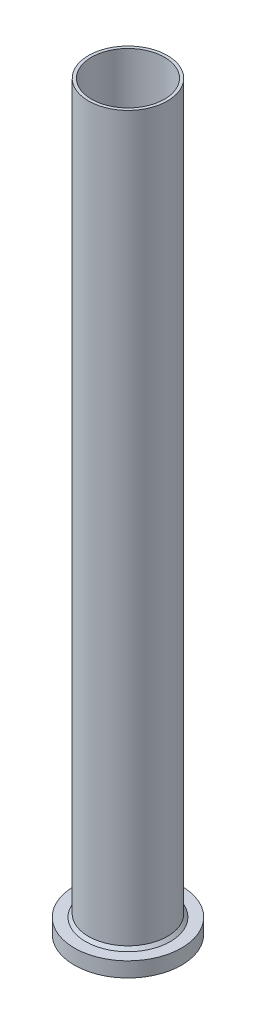
ISO-10303-21;
HEADER;
FILE_DESCRIPTION(('STEP AP214'),'2;1');
FILE_NAME('part.step','',(''),(''),'','','');
FILE_SCHEMA(('AUTOMOTIVE_DESIGN { 1 0 10303 214 1 1 1 1 }'));
ENDSEC;
DATA;
#1=APPLICATION_CONTEXT('core data for automotive mechanical design processes');
#2=APPLICATION_PROTOCOL_DEFINITION('international standard','automotive_design',2000,#1);
#3=PRODUCT_CONTEXT('',#1,'mechanical');
#4=PRODUCT('Part','Part','',(#3));
#5=PRODUCT_RELATED_PRODUCT_CATEGORY('part','',(#4));
#6=PRODUCT_DEFINITION_FORMATION('','',#4);
#7=PRODUCT_DEFINITION_CONTEXT('part definition',#1,'design');
#8=PRODUCT_DEFINITION('design','',#6,#7);
#9=PRODUCT_DEFINITION_SHAPE('','',#8);
#10=(LENGTH_UNIT() NAMED_UNIT(*) SI_UNIT(.MILLI.,.METRE.));
#11=(NAMED_UNIT(*) PLANE_ANGLE_UNIT() SI_UNIT($,.RADIAN.));
#12=(NAMED_UNIT(*) SI_UNIT($,.STERADIAN.) SOLID_ANGLE_UNIT());
#13=UNCERTAINTY_MEASURE_WITH_UNIT(LENGTH_MEASURE(1.E-05),#10,'distance_accuracy_value','');
#14=(GEOMETRIC_REPRESENTATION_CONTEXT(3) GLOBAL_UNCERTAINTY_ASSIGNED_CONTEXT((#13)) GLOBAL_UNIT_ASSIGNED_CONTEXT((#10,
#11,#12)) REPRESENTATION_CONTEXT('',''));
#15=CARTESIAN_POINT('',(0.,0.,0.));
#16=DIRECTION('',(0.,0.,1.));
#17=DIRECTION('',(1.,0.,0.));
#18=AXIS2_PLACEMENT_3D('',#15,#16,#17);
#19=CARTESIAN_POINT('',(0.,5.,0.));
#20=DIRECTION('',(0.,1.,0.));
#21=DIRECTION('',(0.,0.,1.));
#22=AXIS2_PLACEMENT_3D('',#19,#20,#21);
#23=PLANE('',#22);
#24=CARTESIAN_POINT('',(0.,5.,0.));
#25=DIRECTION('',(0.,1.,0.));
#26=DIRECTION('',(0.,0.,1.));
#27=AXIS2_PLACEMENT_3D('',#24,#25,#26);
#28=CIRCLE('',#27,14.25);
#29=CARTESIAN_POINT('',(0.,5.,14.25));
#30=VERTEX_POINT('',#29);
#31=EDGE_CURVE('E48',#30,#30,#28,.F.);
#32=ORIENTED_EDGE('',*,*,#31,.T.);
#33=EDGE_LOOP('',(#32));
#34=FACE_BOUND('',#33,.T.);
#35=CARTESIAN_POINT('',(0.,5.,0.));
#36=DIRECTION('',(0.,1.,0.));
#37=DIRECTION('',(0.,0.,1.));
#38=AXIS2_PLACEMENT_3D('',#35,#36,#37);
#39=CIRCLE('',#38,18.);
#40=CARTESIAN_POINT('',(0.,5.,18.));
#41=VERTEX_POINT('',#40);
#42=EDGE_CURVE('E185',#41,#41,#39,.T.);
#43=ORIENTED_EDGE('',*,*,#42,.T.);
#44=EDGE_LOOP('',(#43));
#45=FACE_BOUND('',#44,.T.);
#46=ADVANCED_FACE('F39',(#34,#45),#23,.T.);
#47=CARTESIAN_POINT('',(0.,0.,0.));
#48=DIRECTION('',(0.,1.,0.));
#49=DIRECTION('',(0.,0.,1.));
#50=AXIS2_PLACEMENT_3D('',#47,#48,#49);
#51=PLANE('',#50);
#52=CARTESIAN_POINT('',(0.,0.,0.));
#53=DIRECTION('',(0.,1.,0.));
#54=DIRECTION('',(0.,0.,1.));
#55=AXIS2_PLACEMENT_3D('',#52,#53,#54);
#56=CIRCLE('',#55,18.);
#57=CARTESIAN_POINT('',(0.,0.,18.));
#58=VERTEX_POINT('',#57);
#59=EDGE_CURVE('E127',#58,#58,#56,.T.);
#60=ORIENTED_EDGE('',*,*,#59,.F.);
#61=EDGE_LOOP('',(#60));
#62=FACE_BOUND('',#61,.T.);
#63=DIRECTION('',(1.,0.,0.));
#64=VECTOR('',#63,1.);
#65=CARTESIAN_POINT('',(-8.08290376865476,0.,14.));
#66=LINE('',#65,#64);
#67=CARTESIAN_POINT('',(-8.08290376865476,0.,14.));
#68=VERTEX_POINT('',#67);
#69=CARTESIAN_POINT('',(8.08290376865477,0.,14.));
#70=VERTEX_POINT('',#69);
#71=EDGE_CURVE('E55',#68,#70,#66,.T.);
#72=ORIENTED_EDGE('',*,*,#71,.T.);
#73=DIRECTION('',(0.5,0.,-0.866025403784439));
#74=VECTOR('',#73,1.);
#75=CARTESIAN_POINT('',(8.08290376865477,0.,14.));
#76=LINE('',#75,#74);
#77=CARTESIAN_POINT('',(16.1658075373095,0.,0.));
#78=VERTEX_POINT('',#77);
#79=EDGE_CURVE('E112',#70,#78,#76,.T.);
#80=ORIENTED_EDGE('',*,*,#79,.T.);
#81=DIRECTION('',(-0.5,0.,-0.866025403784438));
#82=VECTOR('',#81,1.);
#83=CARTESIAN_POINT('',(16.1658075373095,0.,0.));
#84=LINE('',#83,#82);
#85=CARTESIAN_POINT('',(8.08290376865475,0.,-14.));
#86=VERTEX_POINT('',#85);
#87=EDGE_CURVE('E110',#78,#86,#84,.T.);
#88=ORIENTED_EDGE('',*,*,#87,.T.);
#89=DIRECTION('',(-1.,0.,0.));
#90=VECTOR('',#89,1.);
#91=CARTESIAN_POINT('',(8.08290376865475,0.,-14.));
#92=LINE('',#91,#90);
#93=CARTESIAN_POINT('',(-8.08290376865476,0.,-14.));
#94=VERTEX_POINT('',#93);
#95=EDGE_CURVE('E90',#86,#94,#92,.T.);
#96=ORIENTED_EDGE('',*,*,#95,.T.);
#97=DIRECTION('',(-0.5,0.,0.866025403784439));
#98=VECTOR('',#97,1.);
#99=CARTESIAN_POINT('',(-8.08290376865476,0.,-14.));
#100=LINE('',#99,#98);
#101=CARTESIAN_POINT('',(-16.1658075373095,0.,0.));
#102=VERTEX_POINT('',#101);
#103=EDGE_CURVE('E99',#94,#102,#100,.T.);
#104=ORIENTED_EDGE('',*,*,#103,.T.);
#105=DIRECTION('',(0.5,0.,0.866025403784438));
#106=VECTOR('',#105,1.);
#107=CARTESIAN_POINT('',(-16.1658075373095,0.,0.));
#108=LINE('',#107,#106);
#109=EDGE_CURVE('E105',#102,#68,#108,.T.);
#110=ORIENTED_EDGE('',*,*,#109,.T.);
#111=EDGE_LOOP('',(#72,#80,#88,#96,#104,#110));
#112=FACE_BOUND('',#111,.T.);
#113=ADVANCED_FACE('F107',(#62,#112),#51,.F.);
#114=CARTESIAN_POINT('',(0.,4.,0.));
#115=DIRECTION('',(0.,-1.,0.));
#116=DIRECTION('',(0.,0.,-1.));
#117=AXIS2_PLACEMENT_3D('',#114,#115,#116);
#118=CYLINDRICAL_SURFACE('',#117,18.);
#119=ORIENTED_EDGE('',*,*,#59,.T.);
#120=EDGE_LOOP('',(#119));
#121=FACE_BOUND('',#120,.T.);
#122=ORIENTED_EDGE('',*,*,#42,.F.);
#123=EDGE_LOOP('',(#122));
#124=FACE_BOUND('',#123,.T.);
#125=ADVANCED_FACE('F149',(#121,#124),#118,.T.);
#126=CARTESIAN_POINT('',(-8.08290376865476,4.,14.));
#127=DIRECTION('',(0.,0.,-1.));
#128=DIRECTION('',(-1.,0.,0.));
#129=AXIS2_PLACEMENT_3D('',#126,#127,#128);
#130=PLANE('',#129);
#131=ORIENTED_EDGE('',*,*,#71,.F.);
#132=DIRECTION('',(0.,-1.,0.));
#133=VECTOR('',#132,1.);
#134=CARTESIAN_POINT('',(-8.08290376865476,4.,14.));
#135=LINE('',#134,#133);
#136=CARTESIAN_POINT('',(-8.08290376865476,4.,14.));
#137=VERTEX_POINT('',#136);
#138=EDGE_CURVE('E118',#137,#68,#135,.T.);
#139=ORIENTED_EDGE('',*,*,#138,.F.);
#140=DIRECTION('',(1.,0.,0.));
#141=VECTOR('',#140,1.);
#142=CARTESIAN_POINT('',(-8.08290376865476,4.,14.));
#143=LINE('',#142,#141);
#144=CARTESIAN_POINT('',(8.08290376865477,4.,14.));
#145=VERTEX_POINT('',#144);
#146=EDGE_CURVE('E117',#137,#145,#143,.T.);
#147=ORIENTED_EDGE('',*,*,#146,.T.);
#148=DIRECTION('',(0.,-1.,0.));
#149=VECTOR('',#148,1.);
#150=CARTESIAN_POINT('',(8.08290376865477,4.,14.));
#151=LINE('',#150,#149);
#152=EDGE_CURVE('E125',#145,#70,#151,.T.);
#153=ORIENTED_EDGE('',*,*,#152,.T.);
#154=EDGE_LOOP('',(#131,#139,#147,#153));
#155=FACE_BOUND('',#154,.T.);
#156=ADVANCED_FACE('F174',(#155),#130,.T.);
#157=CARTESIAN_POINT('',(8.08290376865477,4.,14.));
#158=DIRECTION('',(-0.866025403784439,0.,-0.5));
#159=DIRECTION('',(-0.5,0.,0.866025403784439));
#160=AXIS2_PLACEMENT_3D('',#157,#158,#159);
#161=PLANE('',#160);
#162=ORIENTED_EDGE('',*,*,#79,.F.);
#163=ORIENTED_EDGE('',*,*,#152,.F.);
#164=DIRECTION('',(0.5,0.,-0.866025403784439));
#165=VECTOR('',#164,1.);
#166=CARTESIAN_POINT('',(8.08290376865477,4.,14.));
#167=LINE('',#166,#165);
#168=CARTESIAN_POINT('',(16.1658075373095,4.,0.));
#169=VERTEX_POINT('',#168);
#170=EDGE_CURVE('E196',#145,#169,#167,.T.);
#171=ORIENTED_EDGE('',*,*,#170,.T.);
#172=DIRECTION('',(0.,-1.,0.));
#173=VECTOR('',#172,1.);
#174=CARTESIAN_POINT('',(16.1658075373095,4.,0.));
#175=LINE('',#174,#173);
#176=EDGE_CURVE('E123',#169,#78,#175,.T.);
#177=ORIENTED_EDGE('',*,*,#176,.T.);
#178=EDGE_LOOP('',(#162,#163,#171,#177));
#179=FACE_BOUND('',#178,.T.);
#180=ADVANCED_FACE('F170',(#179),#161,.T.);
#181=CARTESIAN_POINT('',(16.1658075373095,4.,0.));
#182=DIRECTION('',(-0.866025403784438,0.,0.5));
#183=DIRECTION('',(0.5,0.,0.866025403784438));
#184=AXIS2_PLACEMENT_3D('',#181,#182,#183);
#185=PLANE('',#184);
#186=ORIENTED_EDGE('',*,*,#87,.F.);
#187=ORIENTED_EDGE('',*,*,#176,.F.);
#188=DIRECTION('',(-0.5,0.,-0.866025403784438));
#189=VECTOR('',#188,1.);
#190=CARTESIAN_POINT('',(16.1658075373095,4.,0.));
#191=LINE('',#190,#189);
#192=CARTESIAN_POINT('',(8.08290376865475,4.,-14.));
#193=VERTEX_POINT('',#192);
#194=EDGE_CURVE('E199',#169,#193,#191,.T.);
#195=ORIENTED_EDGE('',*,*,#194,.T.);
#196=DIRECTION('',(0.,-1.,0.));
#197=VECTOR('',#196,1.);
#198=CARTESIAN_POINT('',(8.08290376865475,4.,-14.));
#199=LINE('',#198,#197);
#200=EDGE_CURVE('E95',#193,#86,#199,.T.);
#201=ORIENTED_EDGE('',*,*,#200,.T.);
#202=EDGE_LOOP('',(#186,#187,#195,#201));
#203=FACE_BOUND('',#202,.T.);
#204=ADVANCED_FACE('F167',(#203),#185,.T.);
#205=CARTESIAN_POINT('',(8.08290376865475,4.,-14.));
#206=DIRECTION('',(0.,0.,1.));
#207=DIRECTION('',(1.,0.,0.));
#208=AXIS2_PLACEMENT_3D('',#205,#206,#207);
#209=PLANE('',#208);
#210=ORIENTED_EDGE('',*,*,#95,.F.);
#211=ORIENTED_EDGE('',*,*,#200,.F.);
#212=DIRECTION('',(-1.,0.,0.));
#213=VECTOR('',#212,1.);
#214=CARTESIAN_POINT('',(8.08290376865475,4.,-14.));
#215=LINE('',#214,#213);
#216=CARTESIAN_POINT('',(-8.08290376865476,4.,-14.));
#217=VERTEX_POINT('',#216);
#218=EDGE_CURVE('E64',#193,#217,#215,.T.);
#219=ORIENTED_EDGE('',*,*,#218,.T.);
#220=DIRECTION('',(0.,-1.,0.));
#221=VECTOR('',#220,1.);
#222=CARTESIAN_POINT('',(-8.08290376865476,4.,-14.));
#223=LINE('',#222,#221);
#224=EDGE_CURVE('E85',#217,#94,#223,.T.);
#225=ORIENTED_EDGE('',*,*,#224,.T.);
#226=EDGE_LOOP('',(#210,#211,#219,#225));
#227=FACE_BOUND('',#226,.T.);
#228=ADVANCED_FACE('F87',(#227),#209,.T.);
#229=CARTESIAN_POINT('',(-8.08290376865476,4.,-14.));
#230=DIRECTION('',(0.866025403784439,0.,0.5));
#231=DIRECTION('',(0.5,0.,-0.866025403784439));
#232=AXIS2_PLACEMENT_3D('',#229,#230,#231);
#233=PLANE('',#232);
#234=ORIENTED_EDGE('',*,*,#103,.F.);
#235=ORIENTED_EDGE('',*,*,#224,.F.);
#236=DIRECTION('',(-0.5,0.,0.866025403784439));
#237=VECTOR('',#236,1.);
#238=CARTESIAN_POINT('',(-8.08290376865476,4.,-14.));
#239=LINE('',#238,#237);
#240=CARTESIAN_POINT('',(-16.1658075373095,4.,0.));
#241=VERTEX_POINT('',#240);
#242=EDGE_CURVE('E202',#217,#241,#239,.T.);
#243=ORIENTED_EDGE('',*,*,#242,.T.);
#244=DIRECTION('',(0.,-1.,0.));
#245=VECTOR('',#244,1.);
#246=CARTESIAN_POINT('',(-16.1658075373095,4.,0.));
#247=LINE('',#246,#245);
#248=EDGE_CURVE('E96',#241,#102,#247,.T.);
#249=ORIENTED_EDGE('',*,*,#248,.T.);
#250=EDGE_LOOP('',(#234,#235,#243,#249));
#251=FACE_BOUND('',#250,.T.);
#252=ADVANCED_FACE('F100',(#251),#233,.T.);
#253=CARTESIAN_POINT('',(-16.1658075373095,4.,0.));
#254=DIRECTION('',(0.866025403784438,0.,-0.5));
#255=DIRECTION('',(-0.5,0.,-0.866025403784438));
#256=AXIS2_PLACEMENT_3D('',#253,#254,#255);
#257=PLANE('',#256);
#258=ORIENTED_EDGE('',*,*,#109,.F.);
#259=ORIENTED_EDGE('',*,*,#248,.F.);
#260=DIRECTION('',(0.5,0.,0.866025403784438));
#261=VECTOR('',#260,1.);
#262=CARTESIAN_POINT('',(-16.1658075373095,4.,0.));
#263=LINE('',#262,#261);
#264=EDGE_CURVE('E120',#241,#137,#263,.T.);
#265=ORIENTED_EDGE('',*,*,#264,.T.);
#266=ORIENTED_EDGE('',*,*,#138,.T.);
#267=EDGE_LOOP('',(#258,#259,#265,#266));
#268=FACE_BOUND('',#267,.T.);
#269=ADVANCED_FACE('F158',(#268),#257,.T.);
#270=CARTESIAN_POINT('',(0.,4.,0.));
#271=DIRECTION('',(0.,1.,0.));
#272=DIRECTION('',(0.,0.,1.));
#273=AXIS2_PLACEMENT_3D('',#270,#271,#272);
#274=PLANE('',#273);
#275=CARTESIAN_POINT('',(0.,4.,0.));
#276=DIRECTION('',(0.,1.,0.));
#277=DIRECTION('',(0.,0.,1.));
#278=AXIS2_PLACEMENT_3D('',#275,#276,#277);
#279=CIRCLE('',#278,12.25);
#280=CARTESIAN_POINT('',(0.,4.,12.25));
#281=VERTEX_POINT('',#280);
#282=EDGE_CURVE('E186',#281,#281,#279,.T.);
#283=ORIENTED_EDGE('',*,*,#282,.T.);
#284=EDGE_LOOP('',(#283));
#285=FACE_BOUND('',#284,.T.);
#286=ORIENTED_EDGE('',*,*,#170,.F.);
#287=ORIENTED_EDGE('',*,*,#146,.F.);
#288=ORIENTED_EDGE('',*,*,#264,.F.);
#289=ORIENTED_EDGE('',*,*,#242,.F.);
#290=ORIENTED_EDGE('',*,*,#218,.F.);
#291=ORIENTED_EDGE('',*,*,#194,.F.);
#292=EDGE_LOOP('',(#286,#287,#288,#289,#290,#291));
#293=FACE_BOUND('',#292,.T.);
#294=ADVANCED_FACE('F155',(#285,#293),#274,.F.);
#295=CARTESIAN_POINT('',(0.,5.,0.));
#296=DIRECTION('',(0.,-1.,0.));
#297=DIRECTION('',(0.,0.,-1.));
#298=AXIS2_PLACEMENT_3D('',#295,#296,#297);
#299=CYLINDRICAL_SURFACE('',#298,12.25);
#300=ORIENTED_EDGE('',*,*,#282,.F.);
#301=EDGE_LOOP('',(#300));
#302=FACE_BOUND('',#301,.T.);
#303=CARTESIAN_POINT('',(0.,249.,0.));
#304=DIRECTION('',(0.,1.,0.));
#305=DIRECTION('',(0.,0.,1.));
#306=AXIS2_PLACEMENT_3D('',#303,#304,#305);
#307=CIRCLE('',#306,12.25);
#308=CARTESIAN_POINT('',(0.,249.,12.25));
#309=VERTEX_POINT('',#308);
#310=EDGE_CURVE('E218',#309,#309,#307,.T.);
#311=ORIENTED_EDGE('',*,*,#310,.T.);
#312=EDGE_LOOP('',(#311));
#313=FACE_BOUND('',#312,.T.);
#314=ADVANCED_FACE('F154',(#302,#313),#299,.F.);
#315=CARTESIAN_POINT('',(0.,249.,0.));
#316=DIRECTION('',(0.,1.,0.));
#317=DIRECTION('',(0.,0.,1.));
#318=AXIS2_PLACEMENT_3D('',#315,#316,#317);
#319=PLANE('',#318);
#320=CARTESIAN_POINT('',(0.,249.,0.));
#321=DIRECTION('',(0.,1.,0.));
#322=DIRECTION('',(0.,0.,1.));
#323=AXIS2_PLACEMENT_3D('',#320,#321,#322);
#324=CIRCLE('',#323,13.25);
#325=CARTESIAN_POINT('',(0.,249.,13.25));
#326=VERTEX_POINT('',#325);
#327=EDGE_CURVE('E190',#326,#326,#324,.T.);
#328=ORIENTED_EDGE('',*,*,#327,.T.);
#329=EDGE_LOOP('',(#328));
#330=FACE_BOUND('',#329,.T.);
#331=ORIENTED_EDGE('',*,*,#310,.F.);
#332=EDGE_LOOP('',(#331));
#333=FACE_BOUND('',#332,.T.);
#334=ADVANCED_FACE('F140',(#330,#333),#319,.T.);
#335=CARTESIAN_POINT('',(0.,249.,0.));
#336=DIRECTION('',(0.,-1.,0.));
#337=DIRECTION('',(0.,0.,-1.));
#338=AXIS2_PLACEMENT_3D('',#335,#336,#337);
#339=CYLINDRICAL_SURFACE('',#338,13.25);
#340=CARTESIAN_POINT('',(0.,5.99999999999998,0.));
#341=DIRECTION('',(0.,1.,0.));
#342=DIRECTION('',(0.,0.,1.));
#343=AXIS2_PLACEMENT_3D('',#340,#341,#342);
#344=CIRCLE('',#343,13.25);
#345=CARTESIAN_POINT('',(0.,5.99999999999998,13.25));
#346=VERTEX_POINT('',#345);
#347=EDGE_CURVE('E11',#346,#346,#344,.T.);
#348=ORIENTED_EDGE('',*,*,#347,.T.);
#349=EDGE_LOOP('',(#348));
#350=FACE_BOUND('',#349,.T.);
#351=ORIENTED_EDGE('',*,*,#327,.F.);
#352=EDGE_LOOP('',(#351));
#353=FACE_BOUND('',#352,.T.);
#354=ADVANCED_FACE('F135',(#350,#353),#339,.T.);
#355=CARTESIAN_POINT('',(0.,5.,0.));
#356=DIRECTION('',(0.,-1.,0.));
#357=DIRECTION('',(0.,0.,-1.));
#358=AXIS2_PLACEMENT_3D('',#355,#356,#357);
#359=CONICAL_SURFACE('',#358,14.25,0.785398163397454);
#360=ORIENTED_EDGE('',*,*,#347,.F.);
#361=EDGE_LOOP('',(#360));
#362=FACE_BOUND('',#361,.T.);
#363=ORIENTED_EDGE('',*,*,#31,.F.);
#364=EDGE_LOOP('',(#363));
#365=FACE_BOUND('',#364,.T.);
#366=ADVANCED_FACE('F42',(#362,#365),#359,.T.);
#367=CLOSED_SHELL('',(#46,#113,#125,#156,#180,#204,#228,#252,#269,#294,#314,#334,#354,#366));
#368=MANIFOLD_SOLID_BREP('B2',#367);
#369=ADVANCED_BREP_SHAPE_REPRESENTATION('',(#18,#368),#14);
#370=SHAPE_DEFINITION_REPRESENTATION(#9,#369);
ENDSEC;
END-ISO-10303-21;
